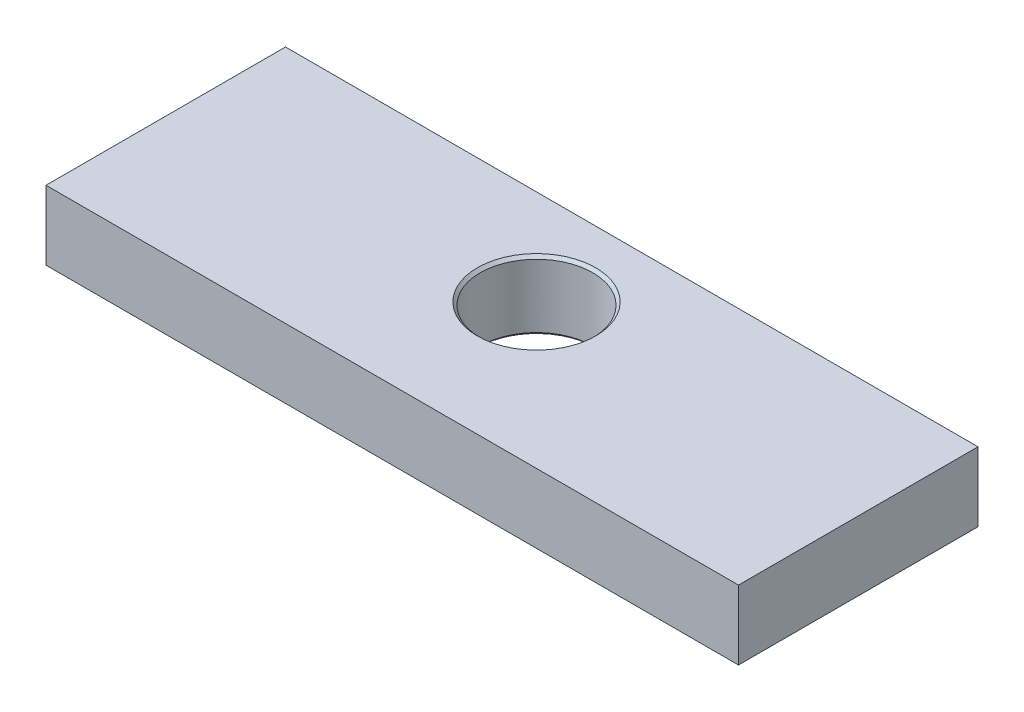
ISO-10303-21;
HEADER;
FILE_DESCRIPTION(('STEP AP214'),'2;1');
FILE_NAME('part.step','',(''),(''),'','','');
FILE_SCHEMA(('AUTOMOTIVE_DESIGN { 1 0 10303 214 1 1 1 1 }'));
ENDSEC;
DATA;
#1=APPLICATION_CONTEXT('core data for automotive mechanical design processes');
#2=APPLICATION_PROTOCOL_DEFINITION('international standard','automotive_design',2000,#1);
#3=PRODUCT_CONTEXT('',#1,'mechanical');
#4=PRODUCT('Part','Part','',(#3));
#5=PRODUCT_RELATED_PRODUCT_CATEGORY('part','',(#4));
#6=PRODUCT_DEFINITION_FORMATION('','',#4);
#7=PRODUCT_DEFINITION_CONTEXT('part definition',#1,'design');
#8=PRODUCT_DEFINITION('design','',#6,#7);
#9=PRODUCT_DEFINITION_SHAPE('','',#8);
#10=(LENGTH_UNIT() NAMED_UNIT(*) SI_UNIT(.MILLI.,.METRE.));
#11=(NAMED_UNIT(*) PLANE_ANGLE_UNIT() SI_UNIT($,.RADIAN.));
#12=(NAMED_UNIT(*) SI_UNIT($,.STERADIAN.) SOLID_ANGLE_UNIT());
#13=UNCERTAINTY_MEASURE_WITH_UNIT(LENGTH_MEASURE(1.E-05),#10,'distance_accuracy_value','');
#14=(GEOMETRIC_REPRESENTATION_CONTEXT(3) GLOBAL_UNCERTAINTY_ASSIGNED_CONTEXT((#13)) GLOBAL_UNIT_ASSIGNED_CONTEXT((#10,
#11,#12)) REPRESENTATION_CONTEXT('',''));
#15=CARTESIAN_POINT('',(0.,0.,0.));
#16=DIRECTION('',(0.,0.,1.));
#17=DIRECTION('',(1.,0.,0.));
#18=AXIS2_PLACEMENT_3D('',#15,#16,#17);
#19=CARTESIAN_POINT('',(-196.686091028777,-278.025070596186,-866.48578652296));
#20=DIRECTION('',(0.,-1.,0.));
#21=DIRECTION('',(0.,0.,-1.));
#22=AXIS2_PLACEMENT_3D('',#19,#20,#21);
#23=CONICAL_SURFACE('',#22,20.5,0.785398163397448);
#24=CARTESIAN_POINT('',(-196.686091028777,-277.025070596185,-866.48578652296));
#25=DIRECTION('',(0.,1.,0.));
#26=DIRECTION('',(-1.,0.,0.));
#27=AXIS2_PLACEMENT_3D('',#24,#25,#26);
#28=CIRCLE('',#27,19.5);
#29=CARTESIAN_POINT('',(-216.186091028777,-277.025070596185,-866.48578652296));
#30=VERTEX_POINT('',#29);
#31=EDGE_CURVE('E66',#30,#30,#28,.T.);
#32=ORIENTED_EDGE('',*,*,#31,.T.);
#33=EDGE_LOOP('',(#32));
#34=FACE_BOUND('',#33,.T.);
#35=CARTESIAN_POINT('',(-196.686091028777,-278.025070596186,-866.48578652296));
#36=DIRECTION('',(0.,-1.,0.));
#37=DIRECTION('',(0.,0.,-1.));
#38=AXIS2_PLACEMENT_3D('',#35,#36,#37);
#39=CIRCLE('',#38,20.5);
#40=CARTESIAN_POINT('',(-196.686091028777,-278.025070596186,-886.98578652296));
#41=VERTEX_POINT('',#40);
#42=EDGE_CURVE('E20',#41,#41,#39,.T.);
#43=ORIENTED_EDGE('',*,*,#42,.T.);
#44=EDGE_LOOP('',(#43));
#45=FACE_BOUND('',#44,.T.);
#46=ADVANCED_FACE('F17',(#34,#45),#23,.F.);
#47=CARTESIAN_POINT('',(-196.686091028777,-278.025070596186,-866.48578652296));
#48=DIRECTION('',(0.,1.,0.));
#49=DIRECTION('',(-1.,0.,0.));
#50=AXIS2_PLACEMENT_3D('',#47,#48,#49);
#51=PLANE('',#50);
#52=ORIENTED_EDGE('',*,*,#42,.F.);
#53=EDGE_LOOP('',(#52));
#54=FACE_BOUND('',#53,.T.);
#55=DIRECTION('',(0.,0.,1.));
#56=VECTOR('',#55,1.);
#57=CARTESIAN_POINT('',(-316.686091028776,-278.02506658903,-866.48578652296));
#58=LINE('',#57,#56);
#59=CARTESIAN_POINT('',(-316.686091028776,-278.025069594397,-816.485801569322));
#60=VERTEX_POINT('',#59);
#61=CARTESIAN_POINT('',(-316.686091028776,-278.025068592608,-899.48578652296));
#62=VERTEX_POINT('',#61);
#63=EDGE_CURVE('E181',#60,#62,#58,.F.);
#64=ORIENTED_EDGE('',*,*,#63,.T.);
#65=DIRECTION('',(1.,0.,0.));
#66=VECTOR('',#65,1.);
#67=CARTESIAN_POINT('',(-196.686091028777,-278.025070596186,-899.48578652296));
#68=LINE('',#67,#66);
#69=CARTESIAN_POINT('',(-76.6860910287774,-278.025070596186,-899.48578652296));
#70=VERTEX_POINT('',#69);
#71=EDGE_CURVE('E60',#62,#70,#68,.T.);
#72=ORIENTED_EDGE('',*,*,#71,.T.);
#73=DIRECTION('',(0.,0.,1.));
#74=VECTOR('',#73,1.);
#75=CARTESIAN_POINT('',(-76.6860910287774,-278.025070596186,-866.48578652296));
#76=LINE('',#75,#74);
#77=CARTESIAN_POINT('',(-76.6860910287774,-278.025070596186,-816.485801569322));
#78=VERTEX_POINT('',#77);
#79=EDGE_CURVE('E58',#78,#70,#76,.F.);
#80=ORIENTED_EDGE('',*,*,#79,.F.);
#81=DIRECTION('',(-1.,0.,0.));
#82=VECTOR('',#81,1.);
#83=CARTESIAN_POINT('',(-196.686085316581,-278.025070596186,-816.485801569322));
#84=LINE('',#83,#82);
#85=EDGE_CURVE('E55',#78,#60,#84,.T.);
#86=ORIENTED_EDGE('',*,*,#85,.T.);
#87=EDGE_LOOP('',(#64,#72,#80,#86));
#88=FACE_BOUND('',#87,.T.);
#89=ADVANCED_FACE('F59',(#54,#88),#51,.F.);
#90=CARTESIAN_POINT('',(-196.686091028777,-278.025070596186,-866.48578652296));
#91=DIRECTION('',(0.,1.,0.));
#92=DIRECTION('',(-1.,0.,0.));
#93=AXIS2_PLACEMENT_3D('',#90,#91,#92);
#94=CYLINDRICAL_SURFACE('',#93,19.5);
#95=ORIENTED_EDGE('',*,*,#31,.F.);
#96=EDGE_LOOP('',(#95));
#97=FACE_BOUND('',#96,.T.);
#98=CARTESIAN_POINT('',(-196.686091028777,-255.025070596186,-866.48578652296));
#99=DIRECTION('',(0.,1.,0.));
#100=DIRECTION('',(-1.,0.,0.));
#101=AXIS2_PLACEMENT_3D('',#98,#99,#100);
#102=CIRCLE('',#101,19.5);
#103=CARTESIAN_POINT('',(-216.186091028777,-255.025070596186,-866.48578652296));
#104=VERTEX_POINT('',#103);
#105=EDGE_CURVE('E81',#104,#104,#102,.T.);
#106=ORIENTED_EDGE('',*,*,#105,.T.);
#107=EDGE_LOOP('',(#106));
#108=FACE_BOUND('',#107,.T.);
#109=ADVANCED_FACE('F92',(#97,#108),#94,.F.);
#110=CARTESIAN_POINT('',(-76.6860910287774,-266.025070596186,-866.48578652296));
#111=DIRECTION('',(1.,0.,0.));
#112=DIRECTION('',(0.,1.,0.));
#113=AXIS2_PLACEMENT_3D('',#110,#111,#112);
#114=PLANE('',#113);
#115=ORIENTED_EDGE('',*,*,#79,.T.);
#116=DIRECTION('',(0.,1.,0.));
#117=VECTOR('',#116,1.);
#118=CARTESIAN_POINT('',(-76.6860910287774,-266.025070596186,-899.48578652296));
#119=LINE('',#118,#117);
#120=CARTESIAN_POINT('',(-76.6860910287774,-254.025070596186,-899.48578652296));
#121=VERTEX_POINT('',#120);
#122=EDGE_CURVE('E184',#70,#121,#119,.T.);
#123=ORIENTED_EDGE('',*,*,#122,.T.);
#124=DIRECTION('',(0.,0.,1.));
#125=VECTOR('',#124,1.);
#126=CARTESIAN_POINT('',(-76.6860910287774,-254.025070596186,-866.48578652296));
#127=LINE('',#126,#125);
#128=CARTESIAN_POINT('',(-76.6860910287774,-254.025070596186,-816.485801569322));
#129=VERTEX_POINT('',#128);
#130=EDGE_CURVE('E77',#121,#129,#127,.T.);
#131=ORIENTED_EDGE('',*,*,#130,.T.);
#132=DIRECTION('',(0.,1.,0.));
#133=VECTOR('',#132,1.);
#134=CARTESIAN_POINT('',(-76.6860910287774,-266.025062581874,-816.485801569322));
#135=LINE('',#134,#133);
#136=EDGE_CURVE('E65',#129,#78,#135,.F.);
#137=ORIENTED_EDGE('',*,*,#136,.T.);
#138=EDGE_LOOP('',(#115,#123,#131,#137));
#139=FACE_BOUND('',#138,.T.);
#140=ADVANCED_FACE('F76',(#139),#114,.T.);
#141=CARTESIAN_POINT('',(-196.686085316581,-266.025062581874,-816.485801569322));
#142=DIRECTION('',(0.,0.,-1.));
#143=DIRECTION('',(-1.,0.,0.));
#144=AXIS2_PLACEMENT_3D('',#141,#142,#143);
#145=PLANE('',#144);
#146=DIRECTION('',(0.,1.,0.));
#147=VECTOR('',#146,1.);
#148=CARTESIAN_POINT('',(-316.686091028776,-266.025070596186,-816.485801569322));
#149=LINE('',#148,#147);
#150=CARTESIAN_POINT('',(-316.686091028776,-254.025070596186,-816.485801569322));
#151=VERTEX_POINT('',#150);
#152=EDGE_CURVE('E73',#151,#60,#149,.F.);
#153=ORIENTED_EDGE('',*,*,#152,.T.);
#154=ORIENTED_EDGE('',*,*,#85,.F.);
#155=ORIENTED_EDGE('',*,*,#136,.F.);
#156=DIRECTION('',(1.,0.,0.));
#157=VECTOR('',#156,1.);
#158=CARTESIAN_POINT('',(-196.686091028777,-254.025070596186,-816.485801569322));
#159=LINE('',#158,#157);
#160=EDGE_CURVE('E191',#129,#151,#159,.F.);
#161=ORIENTED_EDGE('',*,*,#160,.T.);
#162=EDGE_LOOP('',(#153,#154,#155,#161));
#163=FACE_BOUND('',#162,.T.);
#164=ADVANCED_FACE('F70',(#163),#145,.F.);
#165=CARTESIAN_POINT('',(-316.686091028776,-266.025070596186,-866.48578652296));
#166=DIRECTION('',(1.,0.,0.));
#167=DIRECTION('',(0.,1.,0.));
#168=AXIS2_PLACEMENT_3D('',#165,#166,#167);
#169=PLANE('',#168);
#170=DIRECTION('',(0.,1.,0.));
#171=VECTOR('',#170,1.);
#172=CARTESIAN_POINT('',(-316.686091028776,-266.025070596186,-899.48578652296));
#173=LINE('',#172,#171);
#174=CARTESIAN_POINT('',(-316.686091028776,-254.025070596186,-899.48578652296));
#175=VERTEX_POINT('',#174);
#176=EDGE_CURVE('E34',#175,#62,#173,.F.);
#177=ORIENTED_EDGE('',*,*,#176,.T.);
#178=ORIENTED_EDGE('',*,*,#63,.F.);
#179=ORIENTED_EDGE('',*,*,#152,.F.);
#180=DIRECTION('',(0.,0.,1.));
#181=VECTOR('',#180,1.);
#182=CARTESIAN_POINT('',(-316.686091028776,-254.025070596186,-866.48578652296));
#183=LINE('',#182,#181);
#184=EDGE_CURVE('E183',#151,#175,#183,.F.);
#185=ORIENTED_EDGE('',*,*,#184,.T.);
#186=EDGE_LOOP('',(#177,#178,#179,#185));
#187=FACE_BOUND('',#186,.T.);
#188=ADVANCED_FACE('F116',(#187),#169,.F.);
#189=CARTESIAN_POINT('',(-196.686091028777,-266.025070596186,-899.48578652296));
#190=DIRECTION('',(0.,0.,1.));
#191=DIRECTION('',(1.,0.,0.));
#192=AXIS2_PLACEMENT_3D('',#189,#190,#191);
#193=PLANE('',#192);
#194=ORIENTED_EDGE('',*,*,#176,.F.);
#195=DIRECTION('',(1.,0.,0.));
#196=VECTOR('',#195,1.);
#197=CARTESIAN_POINT('',(-196.686091028777,-254.025070596186,-899.48578652296));
#198=LINE('',#197,#196);
#199=EDGE_CURVE('E26',#175,#121,#198,.T.);
#200=ORIENTED_EDGE('',*,*,#199,.T.);
#201=ORIENTED_EDGE('',*,*,#122,.F.);
#202=ORIENTED_EDGE('',*,*,#71,.F.);
#203=EDGE_LOOP('',(#194,#200,#201,#202));
#204=FACE_BOUND('',#203,.T.);
#205=ADVANCED_FACE('F108',(#204),#193,.F.);
#206=CARTESIAN_POINT('',(-196.686091028777,-254.025070596186,-866.48578652296));
#207=DIRECTION('',(0.,1.,0.));
#208=DIRECTION('',(0.,0.,1.));
#209=AXIS2_PLACEMENT_3D('',#206,#207,#208);
#210=CONICAL_SURFACE('',#209,20.5,0.785398163397448);
#211=ORIENTED_EDGE('',*,*,#105,.F.);
#212=EDGE_LOOP('',(#211));
#213=FACE_BOUND('',#212,.T.);
#214=CARTESIAN_POINT('',(-196.686091028777,-254.025070596186,-866.48578652296));
#215=DIRECTION('',(0.,1.,0.));
#216=DIRECTION('',(0.,0.,1.));
#217=AXIS2_PLACEMENT_3D('',#214,#215,#216);
#218=CIRCLE('',#217,20.5);
#219=CARTESIAN_POINT('',(-196.686091028777,-254.025070596186,-845.98578652296));
#220=VERTEX_POINT('',#219);
#221=EDGE_CURVE('E11',#220,#220,#218,.T.);
#222=ORIENTED_EDGE('',*,*,#221,.T.);
#223=EDGE_LOOP('',(#222));
#224=FACE_BOUND('',#223,.T.);
#225=ADVANCED_FACE('F102',(#213,#224),#210,.F.);
#226=CARTESIAN_POINT('',(-196.686091028777,-254.025070596186,-866.48578652296));
#227=DIRECTION('',(0.,-1.,0.));
#228=DIRECTION('',(1.,0.,0.));
#229=AXIS2_PLACEMENT_3D('',#226,#227,#228);
#230=PLANE('',#229);
#231=ORIENTED_EDGE('',*,*,#221,.F.);
#232=EDGE_LOOP('',(#231));
#233=FACE_BOUND('',#232,.T.);
#234=ORIENTED_EDGE('',*,*,#184,.F.);
#235=ORIENTED_EDGE('',*,*,#160,.F.);
#236=ORIENTED_EDGE('',*,*,#130,.F.);
#237=ORIENTED_EDGE('',*,*,#199,.F.);
#238=EDGE_LOOP('',(#234,#235,#236,#237));
#239=FACE_BOUND('',#238,.T.);
#240=ADVANCED_FACE('F100',(#233,#239),#230,.F.);
#241=CLOSED_SHELL('',(#46,#89,#109,#140,#164,#188,#205,#225,#240));
#242=MANIFOLD_SOLID_BREP('B1',#241);
#243=ADVANCED_BREP_SHAPE_REPRESENTATION('',(#18,#242),#14);
#244=SHAPE_DEFINITION_REPRESENTATION(#9,#243);
ENDSEC;
END-ISO-10303-21;
